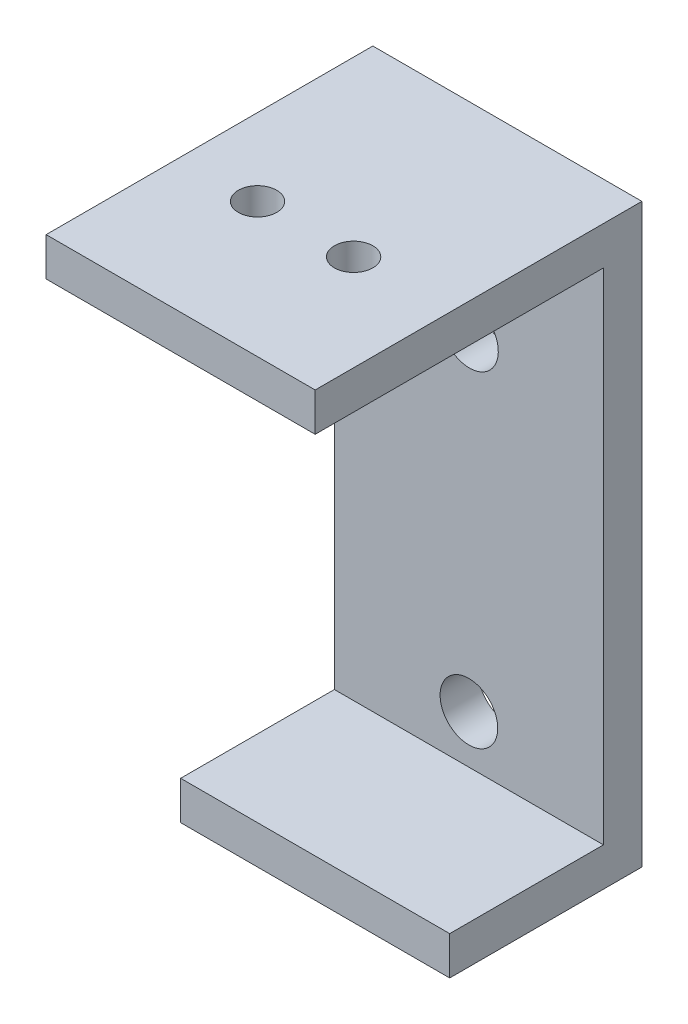
ISO-10303-21;
HEADER;
FILE_DESCRIPTION(('STEP AP214'),'2;1');
FILE_NAME('part.step','',(''),(''),'','','');
FILE_SCHEMA(('AUTOMOTIVE_DESIGN { 1 0 10303 214 1 1 1 1 }'));
ENDSEC;
DATA;
#1=APPLICATION_CONTEXT('core data for automotive mechanical design processes');
#2=APPLICATION_PROTOCOL_DEFINITION('international standard','automotive_design',2000,#1);
#3=PRODUCT_CONTEXT('',#1,'mechanical');
#4=PRODUCT('Part','Part','',(#3));
#5=PRODUCT_RELATED_PRODUCT_CATEGORY('part','',(#4));
#6=PRODUCT_DEFINITION_FORMATION('','',#4);
#7=PRODUCT_DEFINITION_CONTEXT('part definition',#1,'design');
#8=PRODUCT_DEFINITION('design','',#6,#7);
#9=PRODUCT_DEFINITION_SHAPE('','',#8);
#10=(LENGTH_UNIT() NAMED_UNIT(*) SI_UNIT(.MILLI.,.METRE.));
#11=(NAMED_UNIT(*) PLANE_ANGLE_UNIT() SI_UNIT($,.RADIAN.));
#12=(NAMED_UNIT(*) SI_UNIT($,.STERADIAN.) SOLID_ANGLE_UNIT());
#13=UNCERTAINTY_MEASURE_WITH_UNIT(LENGTH_MEASURE(1.E-05),#10,'distance_accuracy_value','');
#14=(GEOMETRIC_REPRESENTATION_CONTEXT(3) GLOBAL_UNCERTAINTY_ASSIGNED_CONTEXT((#13)) GLOBAL_UNIT_ASSIGNED_CONTEXT((#10,
#11,#12)) REPRESENTATION_CONTEXT('',''));
#15=CARTESIAN_POINT('',(0.,0.,0.));
#16=DIRECTION('',(0.,0.,1.));
#17=DIRECTION('',(1.,0.,0.));
#18=AXIS2_PLACEMENT_3D('',#15,#16,#17);
#19=CARTESIAN_POINT('',(14.,2.,0.));
#20=DIRECTION('',(0.,0.,-1.));
#21=DIRECTION('',(0.,1.,0.));
#22=AXIS2_PLACEMENT_3D('',#19,#20,#21);
#23=PLANE('',#22);
#24=DIRECTION('',(0.,-1.,0.));
#25=VECTOR('',#24,1.);
#26=CARTESIAN_POINT('',(0.,2.,0.));
#27=LINE('',#26,#25);
#28=CARTESIAN_POINT('',(0.,2.,0.));
#29=VERTEX_POINT('',#28);
#30=CARTESIAN_POINT('',(0.,0.,0.));
#31=VERTEX_POINT('',#30);
#32=EDGE_CURVE('E145',#29,#31,#27,.T.);
#33=ORIENTED_EDGE('',*,*,#32,.T.);
#34=DIRECTION('',(-1.,0.,0.));
#35=VECTOR('',#34,1.);
#36=CARTESIAN_POINT('',(14.,0.,0.));
#37=LINE('',#36,#35);
#38=CARTESIAN_POINT('',(14.,0.,0.));
#39=VERTEX_POINT('',#38);
#40=EDGE_CURVE('E11',#39,#31,#37,.T.);
#41=ORIENTED_EDGE('',*,*,#40,.F.);
#42=DIRECTION('',(0.,-1.,0.));
#43=VECTOR('',#42,1.);
#44=CARTESIAN_POINT('',(14.,2.,0.));
#45=LINE('',#44,#43);
#46=CARTESIAN_POINT('',(14.,2.,0.));
#47=VERTEX_POINT('',#46);
#48=EDGE_CURVE('E168',#47,#39,#45,.T.);
#49=ORIENTED_EDGE('',*,*,#48,.F.);
#50=DIRECTION('',(-1.,0.,0.));
#51=VECTOR('',#50,1.);
#52=CARTESIAN_POINT('',(14.,2.,0.));
#53=LINE('',#52,#51);
#54=EDGE_CURVE('E141',#47,#29,#53,.T.);
#55=ORIENTED_EDGE('',*,*,#54,.T.);
#56=EDGE_LOOP('',(#33,#41,#49,#55));
#57=FACE_BOUND('',#56,.T.);
#58=ADVANCED_FACE('F42',(#57),#23,.F.);
#59=CARTESIAN_POINT('',(14.,0.,0.));
#60=DIRECTION('',(0.,1.,0.));
#61=DIRECTION('',(0.,0.,1.));
#62=AXIS2_PLACEMENT_3D('',#59,#60,#61);
#63=PLANE('',#62);
#64=DIRECTION('',(0.,0.,-1.));
#65=VECTOR('',#64,1.);
#66=CARTESIAN_POINT('',(0.,0.,0.));
#67=LINE('',#66,#65);
#68=CARTESIAN_POINT('',(0.,0.,-10.));
#69=VERTEX_POINT('',#68);
#70=EDGE_CURVE('E149',#31,#69,#67,.T.);
#71=ORIENTED_EDGE('',*,*,#70,.T.);
#72=DIRECTION('',(-1.,0.,0.));
#73=VECTOR('',#72,1.);
#74=CARTESIAN_POINT('',(14.,0.,-10.));
#75=LINE('',#74,#73);
#76=CARTESIAN_POINT('',(14.,0.,-10.));
#77=VERTEX_POINT('',#76);
#78=EDGE_CURVE('E52',#77,#69,#75,.T.);
#79=ORIENTED_EDGE('',*,*,#78,.F.);
#80=DIRECTION('',(0.,0.,-1.));
#81=VECTOR('',#80,1.);
#82=CARTESIAN_POINT('',(14.,0.,0.));
#83=LINE('',#82,#81);
#84=EDGE_CURVE('E104',#39,#77,#83,.T.);
#85=ORIENTED_EDGE('',*,*,#84,.F.);
#86=ORIENTED_EDGE('',*,*,#40,.T.);
#87=EDGE_LOOP('',(#71,#79,#85,#86));
#88=FACE_BOUND('',#87,.T.);
#89=ADVANCED_FACE('F257',(#88),#63,.F.);
#90=CARTESIAN_POINT('',(14.,0.,-10.));
#91=DIRECTION('',(0.,0.,1.));
#92=DIRECTION('',(1.,0.,0.));
#93=AXIS2_PLACEMENT_3D('',#90,#91,#92);
#94=PLANE('',#93);
#95=CARTESIAN_POINT('',(7.02896335407725,21.5,-10.));
#96=DIRECTION('',(0.,0.,-1.));
#97=DIRECTION('',(-1.,0.,0.));
#98=AXIS2_PLACEMENT_3D('',#95,#96,#97);
#99=CIRCLE('',#98,1.5);
#100=CARTESIAN_POINT('',(5.52896335407725,21.5,-10.));
#101=VERTEX_POINT('',#100);
#102=EDGE_CURVE('E190',#101,#101,#99,.T.);
#103=ORIENTED_EDGE('',*,*,#102,.F.);
#104=EDGE_LOOP('',(#103));
#105=FACE_BOUND('',#104,.T.);
#106=CARTESIAN_POINT('',(7.,4.5,-10.));
#107=DIRECTION('',(0.,0.,-1.));
#108=DIRECTION('',(-1.,0.,0.));
#109=AXIS2_PLACEMENT_3D('',#106,#107,#108);
#110=CIRCLE('',#109,1.5);
#111=CARTESIAN_POINT('',(5.5,4.5,-10.));
#112=VERTEX_POINT('',#111);
#113=EDGE_CURVE('E202',#112,#112,#110,.T.);
#114=ORIENTED_EDGE('',*,*,#113,.F.);
#115=EDGE_LOOP('',(#114));
#116=FACE_BOUND('',#115,.T.);
#117=DIRECTION('',(0.,1.,0.));
#118=VECTOR('',#117,1.);
#119=CARTESIAN_POINT('',(0.,0.,-10.));
#120=LINE('',#119,#118);
#121=CARTESIAN_POINT('',(0.,30.,-10.));
#122=VERTEX_POINT('',#121);
#123=EDGE_CURVE('E153',#69,#122,#120,.T.);
#124=ORIENTED_EDGE('',*,*,#123,.T.);
#125=DIRECTION('',(-1.,0.,0.));
#126=VECTOR('',#125,1.);
#127=CARTESIAN_POINT('',(14.,30.,-10.));
#128=LINE('',#127,#126);
#129=CARTESIAN_POINT('',(14.,30.,-10.));
#130=VERTEX_POINT('',#129);
#131=EDGE_CURVE('E179',#130,#122,#128,.T.);
#132=ORIENTED_EDGE('',*,*,#131,.F.);
#133=DIRECTION('',(0.,1.,0.));
#134=VECTOR('',#133,1.);
#135=CARTESIAN_POINT('',(14.,0.,-10.));
#136=LINE('',#135,#134);
#137=EDGE_CURVE('E222',#77,#130,#136,.T.);
#138=ORIENTED_EDGE('',*,*,#137,.F.);
#139=ORIENTED_EDGE('',*,*,#78,.T.);
#140=EDGE_LOOP('',(#124,#132,#138,#139));
#141=FACE_BOUND('',#140,.T.);
#142=ADVANCED_FACE('F261',(#105,#116,#141),#94,.F.);
#143=CARTESIAN_POINT('',(14.,30.,-10.));
#144=DIRECTION('',(0.,-1.,0.));
#145=DIRECTION('',(0.,0.,-1.));
#146=AXIS2_PLACEMENT_3D('',#143,#144,#145);
#147=PLANE('',#146);
#148=CARTESIAN_POINT('',(4.,30.,0.));
#149=DIRECTION('',(0.,1.,0.));
#150=DIRECTION('',(0.,0.,1.));
#151=AXIS2_PLACEMENT_3D('',#148,#149,#150);
#152=CIRCLE('',#151,1.);
#153=CARTESIAN_POINT('',(4.,30.,1.));
#154=VERTEX_POINT('',#153);
#155=EDGE_CURVE('E196',#154,#154,#152,.T.);
#156=ORIENTED_EDGE('',*,*,#155,.F.);
#157=EDGE_LOOP('',(#156));
#158=FACE_BOUND('',#157,.T.);
#159=CARTESIAN_POINT('',(9.,30.,0.));
#160=DIRECTION('',(0.,1.,0.));
#161=DIRECTION('',(0.,0.,1.));
#162=AXIS2_PLACEMENT_3D('',#159,#160,#161);
#163=CIRCLE('',#162,1.);
#164=CARTESIAN_POINT('',(9.,30.,1.));
#165=VERTEX_POINT('',#164);
#166=EDGE_CURVE('E204',#165,#165,#163,.T.);
#167=ORIENTED_EDGE('',*,*,#166,.F.);
#168=EDGE_LOOP('',(#167));
#169=FACE_BOUND('',#168,.T.);
#170=DIRECTION('',(0.,0.,1.));
#171=VECTOR('',#170,1.);
#172=CARTESIAN_POINT('',(0.,30.,-10.));
#173=LINE('',#172,#171);
#174=CARTESIAN_POINT('',(0.,30.,7.));
#175=VERTEX_POINT('',#174);
#176=EDGE_CURVE('E156',#122,#175,#173,.T.);
#177=ORIENTED_EDGE('',*,*,#176,.T.);
#178=DIRECTION('',(-1.,0.,0.));
#179=VECTOR('',#178,1.);
#180=CARTESIAN_POINT('',(14.,30.,7.));
#181=LINE('',#180,#179);
#182=CARTESIAN_POINT('',(14.,30.,7.));
#183=VERTEX_POINT('',#182);
#184=EDGE_CURVE('E175',#183,#175,#181,.T.);
#185=ORIENTED_EDGE('',*,*,#184,.F.);
#186=DIRECTION('',(0.,0.,1.));
#187=VECTOR('',#186,1.);
#188=CARTESIAN_POINT('',(14.,30.,-10.));
#189=LINE('',#188,#187);
#190=EDGE_CURVE('E225',#130,#183,#189,.T.);
#191=ORIENTED_EDGE('',*,*,#190,.F.);
#192=ORIENTED_EDGE('',*,*,#131,.T.);
#193=EDGE_LOOP('',(#177,#185,#191,#192));
#194=FACE_BOUND('',#193,.T.);
#195=ADVANCED_FACE('F233',(#158,#169,#194),#147,.F.);
#196=CARTESIAN_POINT('',(14.,30.,7.));
#197=DIRECTION('',(0.,0.,-1.));
#198=DIRECTION('',(0.,1.,0.));
#199=AXIS2_PLACEMENT_3D('',#196,#197,#198);
#200=PLANE('',#199);
#201=DIRECTION('',(0.,-1.,0.));
#202=VECTOR('',#201,1.);
#203=CARTESIAN_POINT('',(0.,30.,7.));
#204=LINE('',#203,#202);
#205=CARTESIAN_POINT('',(0.,28.,7.));
#206=VERTEX_POINT('',#205);
#207=EDGE_CURVE('E159',#175,#206,#204,.T.);
#208=ORIENTED_EDGE('',*,*,#207,.T.);
#209=DIRECTION('',(-1.,0.,0.));
#210=VECTOR('',#209,1.);
#211=CARTESIAN_POINT('',(14.,28.,7.));
#212=LINE('',#211,#210);
#213=CARTESIAN_POINT('',(14.,28.,7.));
#214=VERTEX_POINT('',#213);
#215=EDGE_CURVE('E134',#214,#206,#212,.T.);
#216=ORIENTED_EDGE('',*,*,#215,.F.);
#217=DIRECTION('',(0.,-1.,0.));
#218=VECTOR('',#217,1.);
#219=CARTESIAN_POINT('',(14.,30.,7.));
#220=LINE('',#219,#218);
#221=EDGE_CURVE('E123',#183,#214,#220,.T.);
#222=ORIENTED_EDGE('',*,*,#221,.F.);
#223=ORIENTED_EDGE('',*,*,#184,.T.);
#224=EDGE_LOOP('',(#208,#216,#222,#223));
#225=FACE_BOUND('',#224,.T.);
#226=ADVANCED_FACE('F237',(#225),#200,.F.);
#227=CARTESIAN_POINT('',(14.,28.,7.));
#228=DIRECTION('',(0.,1.,0.));
#229=DIRECTION('',(0.,0.,1.));
#230=AXIS2_PLACEMENT_3D('',#227,#228,#229);
#231=PLANE('',#230);
#232=CARTESIAN_POINT('',(4.,28.,0.));
#233=DIRECTION('',(0.,1.,0.));
#234=DIRECTION('',(0.,0.,1.));
#235=AXIS2_PLACEMENT_3D('',#232,#233,#234);
#236=CIRCLE('',#235,1.);
#237=CARTESIAN_POINT('',(4.,28.,1.));
#238=VERTEX_POINT('',#237);
#239=EDGE_CURVE('E45',#238,#238,#236,.T.);
#240=ORIENTED_EDGE('',*,*,#239,.T.);
#241=EDGE_LOOP('',(#240));
#242=FACE_BOUND('',#241,.T.);
#243=CARTESIAN_POINT('',(9.,28.,0.));
#244=DIRECTION('',(0.,1.,0.));
#245=DIRECTION('',(0.,0.,1.));
#246=AXIS2_PLACEMENT_3D('',#243,#244,#245);
#247=CIRCLE('',#246,1.);
#248=CARTESIAN_POINT('',(9.,28.,1.));
#249=VERTEX_POINT('',#248);
#250=EDGE_CURVE('E193',#249,#249,#247,.T.);
#251=ORIENTED_EDGE('',*,*,#250,.T.);
#252=EDGE_LOOP('',(#251));
#253=FACE_BOUND('',#252,.T.);
#254=DIRECTION('',(0.,0.,-1.));
#255=VECTOR('',#254,1.);
#256=CARTESIAN_POINT('',(0.,28.,7.));
#257=LINE('',#256,#255);
#258=CARTESIAN_POINT('',(0.,28.,-8.));
#259=VERTEX_POINT('',#258);
#260=EDGE_CURVE('E132',#206,#259,#257,.T.);
#261=ORIENTED_EDGE('',*,*,#260,.T.);
#262=DIRECTION('',(-1.,0.,0.));
#263=VECTOR('',#262,1.);
#264=CARTESIAN_POINT('',(14.,28.,-8.));
#265=LINE('',#264,#263);
#266=CARTESIAN_POINT('',(14.,28.,-8.));
#267=VERTEX_POINT('',#266);
#268=EDGE_CURVE('E129',#267,#259,#265,.T.);
#269=ORIENTED_EDGE('',*,*,#268,.F.);
#270=DIRECTION('',(0.,0.,-1.));
#271=VECTOR('',#270,1.);
#272=CARTESIAN_POINT('',(14.,28.,7.));
#273=LINE('',#272,#271);
#274=EDGE_CURVE('E117',#214,#267,#273,.T.);
#275=ORIENTED_EDGE('',*,*,#274,.F.);
#276=ORIENTED_EDGE('',*,*,#215,.T.);
#277=EDGE_LOOP('',(#261,#269,#275,#276));
#278=FACE_BOUND('',#277,.T.);
#279=ADVANCED_FACE('F130',(#242,#253,#278),#231,.F.);
#280=CARTESIAN_POINT('',(14.,28.,-8.));
#281=DIRECTION('',(0.,0.,-1.));
#282=DIRECTION('',(0.,1.,0.));
#283=AXIS2_PLACEMENT_3D('',#280,#281,#282);
#284=PLANE('',#283);
#285=CARTESIAN_POINT('',(7.02896335407725,21.5,-8.));
#286=DIRECTION('',(0.,0.,-1.));
#287=DIRECTION('',(0.,1.,0.));
#288=AXIS2_PLACEMENT_3D('',#285,#286,#287);
#289=CIRCLE('',#288,1.5);
#290=CARTESIAN_POINT('',(7.02896335407725,23.,-8.));
#291=VERTEX_POINT('',#290);
#292=EDGE_CURVE('E150',#291,#291,#289,.T.);
#293=ORIENTED_EDGE('',*,*,#292,.T.);
#294=EDGE_LOOP('',(#293));
#295=FACE_BOUND('',#294,.T.);
#296=CARTESIAN_POINT('',(7.,4.5,-8.));
#297=DIRECTION('',(0.,0.,-1.));
#298=DIRECTION('',(0.,1.,0.));
#299=AXIS2_PLACEMENT_3D('',#296,#297,#298);
#300=CIRCLE('',#299,1.5);
#301=CARTESIAN_POINT('',(7.,6.,-8.));
#302=VERTEX_POINT('',#301);
#303=EDGE_CURVE('E186',#302,#302,#300,.T.);
#304=ORIENTED_EDGE('',*,*,#303,.T.);
#305=EDGE_LOOP('',(#304));
#306=FACE_BOUND('',#305,.T.);
#307=DIRECTION('',(0.,-1.,0.));
#308=VECTOR('',#307,1.);
#309=CARTESIAN_POINT('',(0.,28.,-8.));
#310=LINE('',#309,#308);
#311=CARTESIAN_POINT('',(0.,2.,-8.));
#312=VERTEX_POINT('',#311);
#313=EDGE_CURVE('E90',#259,#312,#310,.T.);
#314=ORIENTED_EDGE('',*,*,#313,.T.);
#315=DIRECTION('',(-1.,0.,0.));
#316=VECTOR('',#315,1.);
#317=CARTESIAN_POINT('',(14.,2.,-8.));
#318=LINE('',#317,#316);
#319=CARTESIAN_POINT('',(14.,2.,-8.));
#320=VERTEX_POINT('',#319);
#321=EDGE_CURVE('E135',#320,#312,#318,.T.);
#322=ORIENTED_EDGE('',*,*,#321,.F.);
#323=DIRECTION('',(0.,-1.,0.));
#324=VECTOR('',#323,1.);
#325=CARTESIAN_POINT('',(14.,28.,-8.));
#326=LINE('',#325,#324);
#327=EDGE_CURVE('E121',#267,#320,#326,.T.);
#328=ORIENTED_EDGE('',*,*,#327,.F.);
#329=ORIENTED_EDGE('',*,*,#268,.T.);
#330=EDGE_LOOP('',(#314,#322,#328,#329));
#331=FACE_BOUND('',#330,.T.);
#332=ADVANCED_FACE('F137',(#295,#306,#331),#284,.F.);
#333=CARTESIAN_POINT('',(14.,2.,-8.));
#334=DIRECTION('',(0.,-1.,0.));
#335=DIRECTION('',(0.,0.,-1.));
#336=AXIS2_PLACEMENT_3D('',#333,#334,#335);
#337=PLANE('',#336);
#338=DIRECTION('',(0.,0.,1.));
#339=VECTOR('',#338,1.);
#340=CARTESIAN_POINT('',(0.,2.,-8.));
#341=LINE('',#340,#339);
#342=EDGE_CURVE('E96',#312,#29,#341,.T.);
#343=ORIENTED_EDGE('',*,*,#342,.T.);
#344=ORIENTED_EDGE('',*,*,#54,.F.);
#345=DIRECTION('',(0.,0.,1.));
#346=VECTOR('',#345,1.);
#347=CARTESIAN_POINT('',(14.,2.,-8.));
#348=LINE('',#347,#346);
#349=EDGE_CURVE('E61',#320,#47,#348,.T.);
#350=ORIENTED_EDGE('',*,*,#349,.F.);
#351=ORIENTED_EDGE('',*,*,#321,.T.);
#352=EDGE_LOOP('',(#343,#344,#350,#351));
#353=FACE_BOUND('',#352,.T.);
#354=ADVANCED_FACE('F245',(#353),#337,.F.);
#355=CARTESIAN_POINT('',(14.,0.,0.));
#356=DIRECTION('',(1.,0.,0.));
#357=DIRECTION('',(0.,0.,-1.));
#358=AXIS2_PLACEMENT_3D('',#355,#356,#357);
#359=PLANE('',#358);
#360=ORIENTED_EDGE('',*,*,#48,.T.);
#361=ORIENTED_EDGE('',*,*,#84,.T.);
#362=ORIENTED_EDGE('',*,*,#137,.T.);
#363=ORIENTED_EDGE('',*,*,#190,.T.);
#364=ORIENTED_EDGE('',*,*,#221,.T.);
#365=ORIENTED_EDGE('',*,*,#274,.T.);
#366=ORIENTED_EDGE('',*,*,#327,.T.);
#367=ORIENTED_EDGE('',*,*,#349,.T.);
#368=EDGE_LOOP('',(#360,#361,#362,#363,#364,#365,#366,#367));
#369=FACE_BOUND('',#368,.T.);
#370=ADVANCED_FACE('F119',(#369),#359,.T.);
#371=CARTESIAN_POINT('',(0.,0.,0.));
#372=DIRECTION('',(1.,0.,0.));
#373=DIRECTION('',(0.,0.,-1.));
#374=AXIS2_PLACEMENT_3D('',#371,#372,#373);
#375=PLANE('',#374);
#376=ORIENTED_EDGE('',*,*,#32,.F.);
#377=ORIENTED_EDGE('',*,*,#342,.F.);
#378=ORIENTED_EDGE('',*,*,#313,.F.);
#379=ORIENTED_EDGE('',*,*,#260,.F.);
#380=ORIENTED_EDGE('',*,*,#207,.F.);
#381=ORIENTED_EDGE('',*,*,#176,.F.);
#382=ORIENTED_EDGE('',*,*,#123,.F.);
#383=ORIENTED_EDGE('',*,*,#70,.F.);
#384=EDGE_LOOP('',(#376,#377,#378,#379,#380,#381,#382,#383));
#385=FACE_BOUND('',#384,.T.);
#386=ADVANCED_FACE('F240',(#385),#375,.F.);
#387=CARTESIAN_POINT('',(7.,4.5,4.));
#388=DIRECTION('',(0.,0.,-1.));
#389=DIRECTION('',(-1.,0.,0.));
#390=AXIS2_PLACEMENT_3D('',#387,#388,#389);
#391=CYLINDRICAL_SURFACE('',#390,1.5);
#392=ORIENTED_EDGE('',*,*,#113,.T.);
#393=EDGE_LOOP('',(#392));
#394=FACE_BOUND('',#393,.T.);
#395=ORIENTED_EDGE('',*,*,#303,.F.);
#396=EDGE_LOOP('',(#395));
#397=FACE_BOUND('',#396,.T.);
#398=ADVANCED_FACE('F292',(#394,#397),#391,.F.);
#399=CARTESIAN_POINT('',(7.02896335407725,21.5,4.));
#400=DIRECTION('',(0.,0.,-1.));
#401=DIRECTION('',(-1.,0.,0.));
#402=AXIS2_PLACEMENT_3D('',#399,#400,#401);
#403=CYLINDRICAL_SURFACE('',#402,1.5);
#404=ORIENTED_EDGE('',*,*,#102,.T.);
#405=EDGE_LOOP('',(#404));
#406=FACE_BOUND('',#405,.T.);
#407=ORIENTED_EDGE('',*,*,#292,.F.);
#408=EDGE_LOOP('',(#407));
#409=FACE_BOUND('',#408,.T.);
#410=ADVANCED_FACE('F286',(#406,#409),#403,.F.);
#411=CARTESIAN_POINT('',(9.,16.,0.));
#412=DIRECTION('',(0.,1.,0.));
#413=DIRECTION('',(0.,0.,1.));
#414=AXIS2_PLACEMENT_3D('',#411,#412,#413);
#415=CYLINDRICAL_SURFACE('',#414,1.);
#416=ORIENTED_EDGE('',*,*,#166,.T.);
#417=EDGE_LOOP('',(#416));
#418=FACE_BOUND('',#417,.T.);
#419=ORIENTED_EDGE('',*,*,#250,.F.);
#420=EDGE_LOOP('',(#419));
#421=FACE_BOUND('',#420,.T.);
#422=ADVANCED_FACE('F281',(#418,#421),#415,.F.);
#423=CARTESIAN_POINT('',(4.,16.,0.));
#424=DIRECTION('',(0.,1.,0.));
#425=DIRECTION('',(0.,0.,1.));
#426=AXIS2_PLACEMENT_3D('',#423,#424,#425);
#427=CYLINDRICAL_SURFACE('',#426,1.);
#428=ORIENTED_EDGE('',*,*,#155,.T.);
#429=EDGE_LOOP('',(#428));
#430=FACE_BOUND('',#429,.T.);
#431=ORIENTED_EDGE('',*,*,#239,.F.);
#432=EDGE_LOOP('',(#431));
#433=FACE_BOUND('',#432,.T.);
#434=ADVANCED_FACE('F279',(#430,#433),#427,.F.);
#435=CLOSED_SHELL('',(#58,#89,#142,#195,#226,#279,#332,#354,#370,#386,#398,#410,#422,#434));
#436=MANIFOLD_SOLID_BREP('B2',#435);
#437=ADVANCED_BREP_SHAPE_REPRESENTATION('',(#18,#436),#14);
#438=SHAPE_DEFINITION_REPRESENTATION(#9,#437);
ENDSEC;
END-ISO-10303-21;
